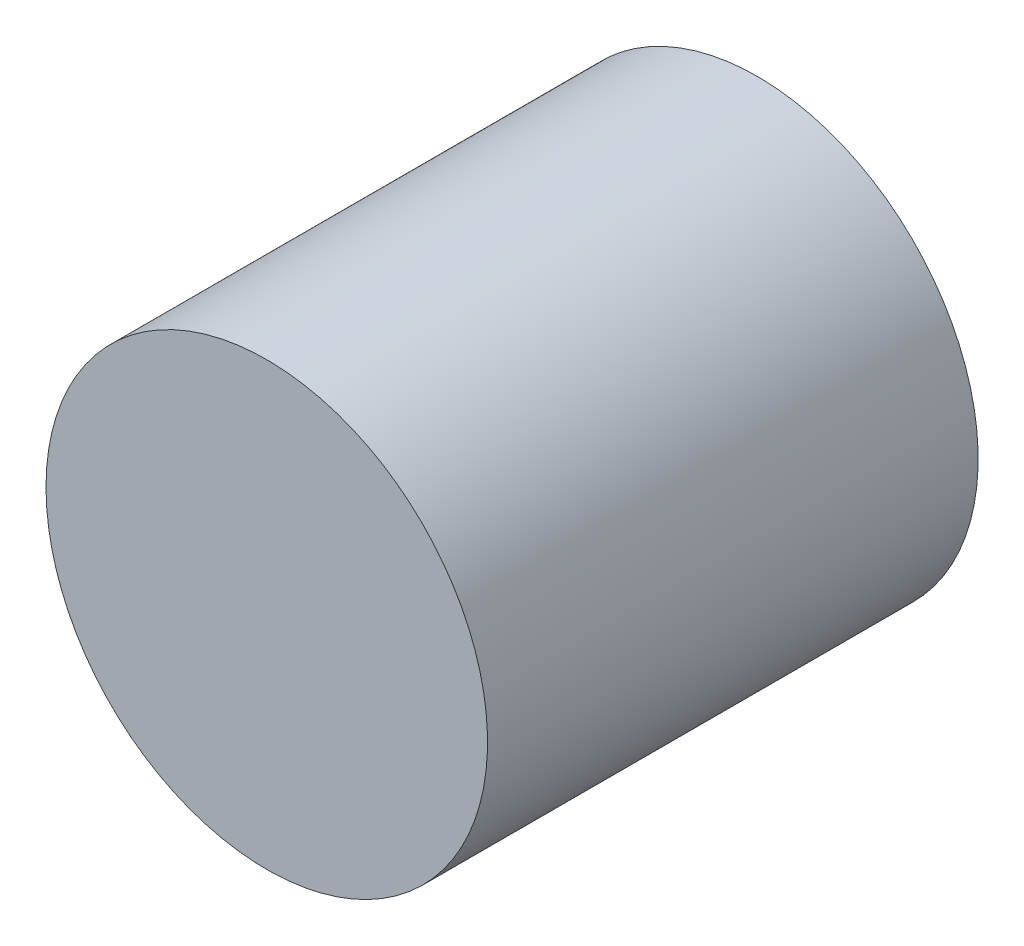
ISO-10303-21;
HEADER;
FILE_DESCRIPTION(('STEP AP214'),'2;1');
FILE_NAME('part.step','',(''),(''),'','','');
FILE_SCHEMA(('AUTOMOTIVE_DESIGN { 1 0 10303 214 1 1 1 1 }'));
ENDSEC;
DATA;
#1=APPLICATION_CONTEXT('core data for automotive mechanical design processes');
#2=APPLICATION_PROTOCOL_DEFINITION('international standard','automotive_design',2000,#1);
#3=PRODUCT_CONTEXT('',#1,'mechanical');
#4=PRODUCT('Part','Part','',(#3));
#5=PRODUCT_RELATED_PRODUCT_CATEGORY('part','',(#4));
#6=PRODUCT_DEFINITION_FORMATION('','',#4);
#7=PRODUCT_DEFINITION_CONTEXT('part definition',#1,'design');
#8=PRODUCT_DEFINITION('design','',#6,#7);
#9=PRODUCT_DEFINITION_SHAPE('','',#8);
#10=(LENGTH_UNIT() NAMED_UNIT(*) SI_UNIT(.MILLI.,.METRE.));
#11=(NAMED_UNIT(*) PLANE_ANGLE_UNIT() SI_UNIT($,.RADIAN.));
#12=(NAMED_UNIT(*) SI_UNIT($,.STERADIAN.) SOLID_ANGLE_UNIT());
#13=UNCERTAINTY_MEASURE_WITH_UNIT(LENGTH_MEASURE(1.E-05),#10,'distance_accuracy_value','');
#14=(GEOMETRIC_REPRESENTATION_CONTEXT(3) GLOBAL_UNCERTAINTY_ASSIGNED_CONTEXT((#13)) GLOBAL_UNIT_ASSIGNED_CONTEXT((#10,
#11,#12)) REPRESENTATION_CONTEXT('',''));
#15=CARTESIAN_POINT('',(0.,0.,0.));
#16=DIRECTION('',(0.,0.,1.));
#17=DIRECTION('',(1.,0.,0.));
#18=AXIS2_PLACEMENT_3D('',#15,#16,#17);
#19=CARTESIAN_POINT('',(0.90000074,0.,0.));
#20=DIRECTION('',(0.,0.,-1.));
#21=DIRECTION('',(-1.,0.,0.));
#22=AXIS2_PLACEMENT_3D('',#19,#20,#21);
#23=PLANE('',#22);
#24=CARTESIAN_POINT('',(0.,0.,0.));
#25=DIRECTION('',(0.,0.,-1.));
#26=DIRECTION('',(-1.,0.,0.));
#27=AXIS2_PLACEMENT_3D('',#24,#25,#26);
#28=CIRCLE('',#27,0.90000074);
#29=CARTESIAN_POINT('',(-0.90000074,0.,0.));
#30=VERTEX_POINT('',#29);
#31=EDGE_CURVE('E18',#30,#30,#28,.F.);
#32=ORIENTED_EDGE('',*,*,#31,.F.);
#33=EDGE_LOOP('',(#32));
#34=FACE_BOUND('',#33,.T.);
#35=ADVANCED_FACE('F15',(#34),#23,.T.);
#36=CARTESIAN_POINT('',(0.90000074,0.,2.00000108));
#37=DIRECTION('',(0.,0.,-1.));
#38=DIRECTION('',(-1.,0.,0.));
#39=AXIS2_PLACEMENT_3D('',#36,#37,#38);
#40=PLANE('',#39);
#41=CARTESIAN_POINT('',(0.,0.,2.00000108));
#42=DIRECTION('',(0.,0.,-1.));
#43=DIRECTION('',(-1.,0.,0.));
#44=AXIS2_PLACEMENT_3D('',#41,#42,#43);
#45=CIRCLE('',#44,0.90000074);
#46=CARTESIAN_POINT('',(-0.90000074,0.,2.00000108));
#47=VERTEX_POINT('',#46);
#48=EDGE_CURVE('E10',#47,#47,#45,.T.);
#49=ORIENTED_EDGE('',*,*,#48,.F.);
#50=EDGE_LOOP('',(#49));
#51=FACE_BOUND('',#50,.T.);
#52=ADVANCED_FACE('F30',(#51),#40,.F.);
#53=CARTESIAN_POINT('',(0.,0.,0.));
#54=DIRECTION('',(0.,0.,-1.));
#55=DIRECTION('',(-1.,0.,0.));
#56=AXIS2_PLACEMENT_3D('',#53,#54,#55);
#57=CYLINDRICAL_SURFACE('',#56,0.90000074);
#58=ORIENTED_EDGE('',*,*,#48,.T.);
#59=EDGE_LOOP('',(#58));
#60=FACE_BOUND('',#59,.T.);
#61=ORIENTED_EDGE('',*,*,#31,.T.);
#62=EDGE_LOOP('',(#61));
#63=FACE_BOUND('',#62,.T.);
#64=ADVANCED_FACE('F27',(#60,#63),#57,.T.);
#65=CLOSED_SHELL('',(#35,#52,#64));
#66=MANIFOLD_SOLID_BREP('B1',#65);
#67=ADVANCED_BREP_SHAPE_REPRESENTATION('',(#18,#66),#14);
#68=SHAPE_DEFINITION_REPRESENTATION(#9,#67);
ENDSEC;
END-ISO-10303-21;
